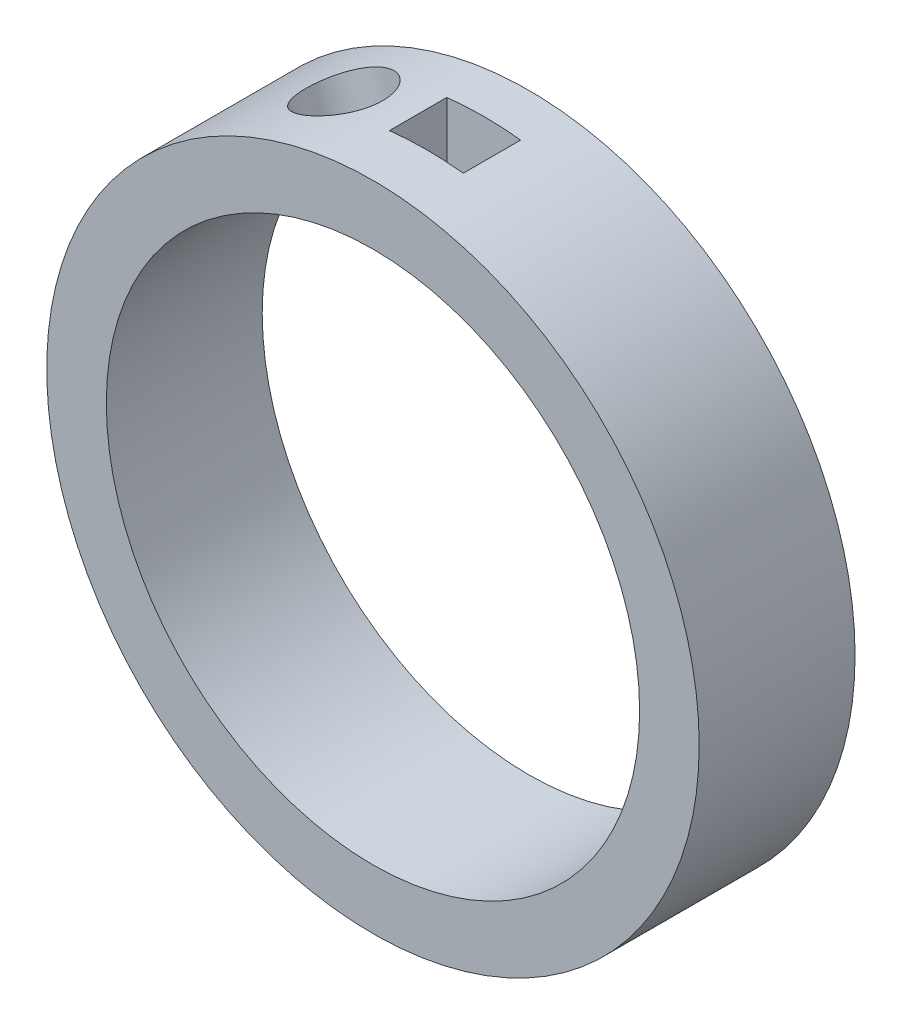
ISO-10303-21;
HEADER;
FILE_DESCRIPTION(('STEP AP214'),'2;1');
FILE_NAME('part.step','',(''),(''),'','','');
FILE_SCHEMA(('AUTOMOTIVE_DESIGN { 1 0 10303 214 1 1 1 1 }'));
ENDSEC;
DATA;
#1=APPLICATION_CONTEXT('core data for automotive mechanical design processes');
#2=APPLICATION_PROTOCOL_DEFINITION('international standard','automotive_design',2000,#1);
#3=PRODUCT_CONTEXT('',#1,'mechanical');
#4=PRODUCT('Part','Part','',(#3));
#5=PRODUCT_RELATED_PRODUCT_CATEGORY('part','',(#4));
#6=PRODUCT_DEFINITION_FORMATION('','',#4);
#7=PRODUCT_DEFINITION_CONTEXT('part definition',#1,'design');
#8=PRODUCT_DEFINITION('design','',#6,#7);
#9=PRODUCT_DEFINITION_SHAPE('','',#8);
#10=(LENGTH_UNIT() NAMED_UNIT(*) SI_UNIT(.MILLI.,.METRE.));
#11=(NAMED_UNIT(*) PLANE_ANGLE_UNIT() SI_UNIT($,.RADIAN.));
#12=(NAMED_UNIT(*) SI_UNIT($,.STERADIAN.) SOLID_ANGLE_UNIT());
#13=UNCERTAINTY_MEASURE_WITH_UNIT(LENGTH_MEASURE(1.E-05),#10,'distance_accuracy_value','');
#14=(GEOMETRIC_REPRESENTATION_CONTEXT(3) GLOBAL_UNCERTAINTY_ASSIGNED_CONTEXT((#13)) GLOBAL_UNIT_ASSIGNED_CONTEXT((#10,
#11,#12)) REPRESENTATION_CONTEXT('',''));
#15=CARTESIAN_POINT('',(0.,0.,0.));
#16=DIRECTION('',(0.,0.,1.));
#17=DIRECTION('',(1.,0.,0.));
#18=AXIS2_PLACEMENT_3D('',#15,#16,#17);
#19=CARTESIAN_POINT('',(0.,0.,-133.006180114648));
#20=DIRECTION('',(0.,0.,1.));
#21=DIRECTION('',(1.,0.,0.));
#22=AXIS2_PLACEMENT_3D('',#19,#20,#21);
#23=CYLINDRICAL_SURFACE('',#22,50.4952);
#24=DIRECTION('',(0.,0.,1.));
#25=VECTOR('',#24,1.);
#26=CARTESIAN_POINT('',(5.715,50.1707484301361,-133.006180114648));
#27=LINE('',#26,#25);
#28=CARTESIAN_POINT('',(5.715,50.1707484301361,-4.445));
#29=VERTEX_POINT('',#28);
#30=CARTESIAN_POINT('',(5.715,50.1707484301361,4.445));
#31=VERTEX_POINT('',#30);
#32=EDGE_CURVE('E11',#29,#31,#27,.T.);
#33=ORIENTED_EDGE('',*,*,#32,.T.);
#34=CARTESIAN_POINT('',(0.,0.,4.445));
#35=DIRECTION('',(0.,0.,-1.));
#36=DIRECTION('',(-1.,0.,0.));
#37=AXIS2_PLACEMENT_3D('',#34,#35,#36);
#38=CIRCLE('',#37,50.4952);
#39=CARTESIAN_POINT('',(-5.715,50.1707484301361,4.445));
#40=VERTEX_POINT('',#39);
#41=EDGE_CURVE('E25',#31,#40,#38,.F.);
#42=ORIENTED_EDGE('',*,*,#41,.T.);
#43=DIRECTION('',(0.,0.,1.));
#44=VECTOR('',#43,1.);
#45=CARTESIAN_POINT('',(-5.715,50.1707484301361,-133.006180114648));
#46=LINE('',#45,#44);
#47=CARTESIAN_POINT('',(-5.715,50.1707484301361,-4.445));
#48=VERTEX_POINT('',#47);
#49=EDGE_CURVE('E77',#48,#40,#46,.T.);
#50=ORIENTED_EDGE('',*,*,#49,.F.);
#51=CARTESIAN_POINT('',(0.,0.,-4.445));
#52=DIRECTION('',(0.,0.,-1.));
#53=DIRECTION('',(-1.,0.,0.));
#54=AXIS2_PLACEMENT_3D('',#51,#52,#53);
#55=CIRCLE('',#54,50.4952);
#56=EDGE_CURVE('E117',#29,#48,#55,.F.);
#57=ORIENTED_EDGE('',*,*,#56,.F.);
#58=EDGE_LOOP('',(#33,#42,#50,#57));
#59=FACE_BOUND('',#58,.T.);
#60=CARTESIAN_POINT('',(0.,0.,12.7));
#61=DIRECTION('',(0.,0.,1.));
#62=DIRECTION('',(1.,0.,0.));
#63=AXIS2_PLACEMENT_3D('',#60,#61,#62);
#64=CIRCLE('',#63,50.4952);
#65=CARTESIAN_POINT('',(50.4952,0.,12.7));
#66=VERTEX_POINT('',#65);
#67=EDGE_CURVE('E114',#66,#66,#64,.T.);
#68=ORIENTED_EDGE('',*,*,#67,.F.);
#69=EDGE_LOOP('',(#68));
#70=FACE_BOUND('',#69,.T.);
#71=CARTESIAN_POINT('',(0.,0.,-11.43));
#72=DIRECTION('',(0.,0.,-1.));
#73=DIRECTION('',(-1.,0.,0.));
#74=AXIS2_PLACEMENT_3D('',#71,#72,#73);
#75=CIRCLE('',#74,50.4952);
#76=CARTESIAN_POINT('',(-50.4952,0.,-11.43));
#77=VERTEX_POINT('',#76);
#78=EDGE_CURVE('E109',#77,#77,#75,.T.);
#79=ORIENTED_EDGE('',*,*,#78,.F.);
#80=EDGE_LOOP('',(#79));
#81=FACE_BOUND('',#80,.T.);
#82=CARTESIAN_POINT('',(-11.1662246003937,49.245107891176,0.));
#83=CARTESIAN_POINT('',(-11.16622243087,49.2451079241868,0.17764524019137));
#84=CARTESIAN_POINT('',(-11.1735559833573,49.2434471139217,0.355260441256935));
#85=CARTESIAN_POINT('',(-11.2028264549851,49.236796595876,0.709276962477321));
#86=CARTESIAN_POINT('',(-11.2247666785135,49.231806134846,0.885677998833001));
#87=CARTESIAN_POINT('',(-11.2830936641882,49.2184712387936,1.23607713344171));
#88=CARTESIAN_POINT('',(-11.3194911672237,49.2101243100603,1.41007334537517));
#89=CARTESIAN_POINT('',(-11.4064439579126,49.190042177864,1.75436028498324));
#90=CARTESIAN_POINT('',(-11.4570044326884,49.1783057329576,1.92464963036286));
#91=CARTESIAN_POINT('',(-11.5717995424469,49.1514205945674,2.26007451008197));
#92=CARTESIAN_POINT('',(-11.6360196826027,49.1362755171397,2.42521529643946));
#93=CARTESIAN_POINT('',(-11.777670262342,49.1025152700211,2.7494351733241));
#94=CARTESIAN_POINT('',(-11.855105567596,49.0838988219771,2.90851200468702));
#95=CARTESIAN_POINT('',(-12.022504545878,49.0431648630898,3.21934774415985));
#96=CARTESIAN_POINT('',(-12.1124613503693,49.0210492707624,3.37111060324377));
#97=CARTESIAN_POINT('',(-12.3042631689757,48.9732590124598,3.66641747210631));
#98=CARTESIAN_POINT('',(-12.4061125845377,48.9475830281226,3.80995840947533));
#99=CARTESIAN_POINT('',(-12.6213877039433,48.8925167352067,4.08842355053718));
#100=CARTESIAN_POINT('',(-12.7348654736039,48.8631095668642,4.22330417191771));
#101=CARTESIAN_POINT('',(-12.9721653750475,48.8006475649764,4.48281914233161));
#102=CARTESIAN_POINT('',(-13.0959913171778,48.7675913863619,4.60744968332333));
#103=CARTESIAN_POINT('',(-13.3529656738582,48.6978566777965,4.84550133865111));
#104=CARTESIAN_POINT('',(-13.4861111137727,48.6611793021533,4.95892600210177));
#105=CARTESIAN_POINT('',(-13.7608036765789,48.5842140415354,5.17385424191154));
#106=CARTESIAN_POINT('',(-13.9023538804553,48.5439248297545,5.27535340554613));
#107=CARTESIAN_POINT('',(-14.1931841361496,48.4596917826087,5.46594717896368));
#108=CARTESIAN_POINT('',(-14.3424860219449,48.4157373864542,5.55500381590273));
#109=CARTESIAN_POINT('',(-14.6473590085822,48.3243772365615,5.7197398314255));
#110=CARTESIAN_POINT('',(-14.8029324154714,48.2769702080207,5.7954142332201));
#111=CARTESIAN_POINT('',(-15.1190831282482,48.1788947148525,5.93276510074974));
#112=CARTESIAN_POINT('',(-15.2796584109043,48.128227560313,5.99444714480022));
#113=CARTESIAN_POINT('',(-15.6046727360808,48.0238342056118,6.10341372526418));
#114=CARTESIAN_POINT('',(-15.7691131738262,47.9701068905301,6.15069297390697));
#115=CARTESIAN_POINT('',(-16.2645264283577,47.8053386769818,6.26985904597561));
#116=CARTESIAN_POINT('',(-16.5996359527191,47.6900804664527,6.31995905979723));
#117=CARTESIAN_POINT('',(-17.2703033571211,47.4513306187826,6.36001359524782));
#118=CARTESIAN_POINT('',(-17.6058612187912,47.3278393094315,6.34997050998239));
#119=CARTESIAN_POINT('',(-18.2661723833157,47.0769174667346,6.27035402432538));
#120=CARTESIAN_POINT('',(-18.5909760008592,46.9495131175358,6.2011171273482));
#121=CARTESIAN_POINT('',(-19.2227792246956,46.694391157762,6.00558335199996));
#122=CARTESIAN_POINT('',(-19.5297784889346,46.5666735412177,5.87928537779128));
#123=CARTESIAN_POINT('',(-20.1186597373741,46.3153066255317,5.57286264651147));
#124=CARTESIAN_POINT('',(-20.4004710919111,46.1916693441179,5.3925923369177));
#125=CARTESIAN_POINT('',(-20.9308152662557,45.9537899048367,4.98344653521398));
#126=CARTESIAN_POINT('',(-21.1793465405473,45.8395481833909,4.75456878706603));
#127=CARTESIAN_POINT('',(-21.6385112033995,45.6246084867768,4.25282056879936));
#128=CARTESIAN_POINT('',(-21.8488705474266,45.5240096646722,3.97965673791803));
#129=CARTESIAN_POINT('',(-22.2242945193402,45.3419191165031,3.39809782430482));
#130=CARTESIAN_POINT('',(-22.3893590021298,45.2604274516463,3.08970262871785));
#131=CARTESIAN_POINT('',(-22.6701079495734,45.1204628421622,2.44617431325994));
#132=CARTESIAN_POINT('',(-22.7857710060322,45.0619998779147,2.11102967598714));
#133=CARTESIAN_POINT('',(-22.9646499330511,44.9711044575202,1.42365174392431));
#134=CARTESIAN_POINT('',(-23.027868362885,44.9386707311609,1.07141928390022));
#135=CARTESIAN_POINT('',(-23.0999773358227,44.9016472950138,0.362438729928718));
#136=CARTESIAN_POINT('',(-23.1092357929607,44.8968690242277,0.00573787476633659));
#137=CARTESIAN_POINT('',(-23.0741711970576,44.9148997548105,-0.704310129539777));
#138=CARTESIAN_POINT('',(-23.0298493002611,44.9377081608688,-1.05765735088789));
#139=CARTESIAN_POINT('',(-22.8890098865747,45.0096056608597,-1.74973737224277));
#140=CARTESIAN_POINT('',(-22.792671155945,45.0586047295077,-2.08851596463985));
#141=CARTESIAN_POINT('',(-22.5503410496534,45.1803676518057,-2.74327494298447));
#142=CARTESIAN_POINT('',(-22.4043479095056,45.2531323499717,-3.05925451827768));
#143=CARTESIAN_POINT('',(-22.0654166867085,45.4193603284046,-3.66130147555207));
#144=CARTESIAN_POINT('',(-21.8722319307493,45.5129321301864,-3.94720000576348));
#145=CARTESIAN_POINT('',(-21.4441081693305,45.7162056086007,-4.47924593904025));
#146=CARTESIAN_POINT('',(-21.2091675196768,45.8259079203642,-4.72539177606154));
#147=CARTESIAN_POINT('',(-20.7019199596484,46.0572877110549,-5.17238752981236));
#148=CARTESIAN_POINT('',(-20.4294052219602,46.1790306485556,-5.37296783049312));
#149=CARTESIAN_POINT('',(-19.8550625048109,46.4288661647257,-5.72127108617559));
#150=CARTESIAN_POINT('',(-19.5532351224677,46.5569586140254,-5.8689951176075));
#151=CARTESIAN_POINT('',(-18.9292304329555,46.8141329384565,-6.1069541518739));
#152=CARTESIAN_POINT('',(-18.6071108261159,46.943211165812,-6.19734472961255));
#153=CARTESIAN_POINT('',(-17.9504411481861,47.1982052556889,-6.31855292797034));
#154=CARTESIAN_POINT('',(-17.6158916454779,47.324121262369,-6.34937326914997));
#155=CARTESIAN_POINT('',(-17.1135397844069,47.5070923350989,-6.35029828705626));
#156=CARTESIAN_POINT('',(-16.9464928339249,47.5669316144663,-6.34314252678187));
#157=CARTESIAN_POINT('',(-16.6129492335679,47.6844449653999,-6.31401155546971));
#158=CARTESIAN_POINT('',(-16.4464524018997,47.742119835128,-6.29204186514639));
#159=CARTESIAN_POINT('',(-16.1151475522208,47.8549674668469,-6.23342869799899));
#160=CARTESIAN_POINT('',(-15.9503401694554,47.9101393125978,-6.19677989532447));
#161=CARTESIAN_POINT('',(-15.6237196362072,48.0176441474498,-6.10909876494134));
#162=CARTESIAN_POINT('',(-15.4619054191765,48.0699781611083,-6.0580716700901));
#163=CARTESIAN_POINT('',(-15.1423964052569,48.1715804401475,-5.94200092154198));
#164=CARTESIAN_POINT('',(-14.9847015953778,48.2208487151963,-5.87695731205088));
#165=CARTESIAN_POINT('',(-14.67464183068,48.3161091801984,-5.73334995742399));
#166=CARTESIAN_POINT('',(-14.522274965043,48.3621025509277,-5.65479112050045));
#167=CARTESIAN_POINT('',(-14.223875599998,48.4507050724001,-5.48466601820468));
#168=CARTESIAN_POINT('',(-14.0778454459458,48.4933129748753,-5.39309498944344));
#169=CARTESIAN_POINT('',(-13.793307870899,48.5750119563282,-5.19764836020996));
#170=CARTESIAN_POINT('',(-13.6547977700587,48.6141042914166,-5.09377718555372));
#171=CARTESIAN_POINT('',(-13.3853300453926,48.6889911418229,-4.87365954302255));
#172=CARTESIAN_POINT('',(-13.2544320416336,48.7247606707602,-4.75733157721416));
#173=CARTESIAN_POINT('',(-13.0022855453458,48.792651485829,-4.5137650608015));
#174=CARTESIAN_POINT('',(-12.8810335725943,48.8247740895494,-4.38653047996718));
#175=CARTESIAN_POINT('',(-12.6489826172454,48.8854053470116,-4.12192013351711));
#176=CARTESIAN_POINT('',(-12.5381899993699,48.9139118038373,-3.98453828255911));
#177=CARTESIAN_POINT('',(-12.3280383120587,48.9672997830887,-3.70071008815298));
#178=CARTESIAN_POINT('',(-12.2286750356447,48.9921826402129,-3.5542671106992));
#179=CARTESIAN_POINT('',(-12.0417145777264,49.0384711390245,-3.25264332203579));
#180=CARTESIAN_POINT('',(-11.9541697067521,49.0598614039636,-3.09742771753361));
#181=CARTESIAN_POINT('',(-11.7920862066084,49.0990720777063,-2.77998966179634));
#182=CARTESIAN_POINT('',(-11.7175428055775,49.1168937966119,-2.61776980868126));
#183=CARTESIAN_POINT('',(-11.5820846257929,49.1490120594498,-2.28754371201484));
#184=CARTESIAN_POINT('',(-11.521159221816,49.1633113525938,-2.11954209853444));
#185=CARTESIAN_POINT('',(-11.413382579187,49.1884435099628,-1.77889048243625));
#186=CARTESIAN_POINT('',(-11.3665280232082,49.1992771912756,-1.60624158593174));
#187=CARTESIAN_POINT('',(-11.273623302502,49.2206631897597,-1.19741524862157));
#188=CARTESIAN_POINT('',(-11.233396131225,49.2298363046774,-0.959817415133804));
#189=CARTESIAN_POINT('',(-11.1796983532134,49.2420586093948,-0.481461321584235));
#190=CARTESIAN_POINT('',(-11.1662275400225,49.2451078464475,-0.240703085923028));
#191=CARTESIAN_POINT('',(-11.1662246003937,49.245107891176,0.));
#192=B_SPLINE_CURVE_WITH_KNOTS('',3,(#82,#83,#84,#85,#86,#87,#88,#89,#90,#91,#92,#93,#94,#95,
#96,#97,#98,#99,#100,#101,#102,#103,#104,#105,#106,#107,#108,#109,#110,#111,#112,#113,#114,#115,
#116,#117,#118,#119,#120,#121,#122,#123,#124,#125,#126,#127,#128,#129,#130,#131,#132,#133,#134,
#135,#136,#137,#138,#139,#140,#141,#142,#143,#144,#145,#146,#147,#148,#149,#150,#151,#152,#153,
#154,#155,#156,#157,#158,#159,#160,#161,#162,#163,#164,#165,#166,#167,#168,#169,#170,#171,#172,
#173,#174,#175,#176,#177,#178,#179,#180,#181,#182,#183,#184,#185,#186,#187,#188,#189,#190,#191),
.UNSPECIFIED.,.T.,.F.,(4,2,2,2,2,2,2,2,2,2,2,2,2,2,2,2,2,2,2,2,2,2,2,2,2,2,2,2,2,2,2,2,2,2,2,2,
2,2,2,2,2,2,2,2,2,2,2,2,2,2,2,2,2,2,4),(0.,0.532725040705638,1.06557063787708,1.59881284995072,
2.13225061541487,2.66512512741974,3.19819626259905,3.73097613117087,4.26395380992556,
4.79943182216301,5.33510788133894,5.87061373413399,6.40631711718759,6.94362125761861,
7.48112480057233,8.018413679598,8.55589957912022,9.62401314895373,10.6920842186231,
11.7541236140249,12.8161834063814,13.8811335618231,14.946133156062,16.0184997107916,
17.0908697006823,18.1637039336573,19.236485809732,20.3019445256539,21.3673802497695,
22.4291770780885,23.4910116416513,24.5585199205186,25.626070243265,26.6997817436323,
27.7734713763709,28.844234935045,29.9149495910111,30.4471881967624,30.9792285624405,
31.511462137205,32.0435022597086,32.5755407042704,33.1073863391721,33.6394271714338,
34.1712771441302,34.7068481464128,35.2422250335917,35.7779256359783,36.3134284192811,
36.8512287340623,37.3888312455326,37.9260128256271,38.4630676608161,39.1848970245053,
39.9067208184228),.UNSPECIFIED.);
#193=CARTESIAN_POINT('',(-11.1662246003937,49.245107891176,0.));
#194=VERTEX_POINT('',#193);
#195=EDGE_CURVE('E101',#194,#194,#192,.T.);
#196=ORIENTED_EDGE('',*,*,#195,.T.);
#197=EDGE_LOOP('',(#196));
#198=FACE_BOUND('',#197,.T.);
#199=ADVANCED_FACE('F17',(#59,#70,#81,#198),#23,.T.);
#200=CARTESIAN_POINT('',(0.,0.,-12.7));
#201=DIRECTION('',(0.,0.,1.));
#202=DIRECTION('',(1.,0.,0.));
#203=AXIS2_PLACEMENT_3D('',#200,#201,#202);
#204=CYLINDRICAL_SURFACE('',#203,41.275);
#205=CARTESIAN_POINT('',(0.,0.,12.7));
#206=DIRECTION('',(0.,0.,1.));
#207=DIRECTION('',(1.,0.,0.));
#208=AXIS2_PLACEMENT_3D('',#205,#206,#207);
#209=CIRCLE('',#208,41.275);
#210=CARTESIAN_POINT('',(41.275,0.,12.7));
#211=VERTEX_POINT('',#210);
#212=EDGE_CURVE('E110',#211,#211,#209,.T.);
#213=ORIENTED_EDGE('',*,*,#212,.T.);
#214=EDGE_LOOP('',(#213));
#215=FACE_BOUND('',#214,.T.);
#216=CARTESIAN_POINT('',(0.,0.,-11.43));
#217=DIRECTION('',(0.,0.,-1.));
#218=DIRECTION('',(-1.,0.,0.));
#219=AXIS2_PLACEMENT_3D('',#216,#217,#218);
#220=CIRCLE('',#219,41.275);
#221=CARTESIAN_POINT('',(-41.275,0.,-11.43));
#222=VERTEX_POINT('',#221);
#223=EDGE_CURVE('E73',#222,#222,#220,.T.);
#224=ORIENTED_EDGE('',*,*,#223,.T.);
#225=EDGE_LOOP('',(#224));
#226=FACE_BOUND('',#225,.T.);
#227=CARTESIAN_POINT('',(0.,0.,4.445));
#228=DIRECTION('',(0.,0.,-1.));
#229=DIRECTION('',(-1.,0.,0.));
#230=AXIS2_PLACEMENT_3D('',#227,#228,#229);
#231=CIRCLE('',#230,41.275);
#232=CARTESIAN_POINT('',(5.715,40.8774314261549,4.445));
#233=VERTEX_POINT('',#232);
#234=CARTESIAN_POINT('',(-5.715,40.8774314261549,4.445));
#235=VERTEX_POINT('',#234);
#236=EDGE_CURVE('E56',#233,#235,#231,.F.);
#237=ORIENTED_EDGE('',*,*,#236,.F.);
#238=DIRECTION('',(0.,0.,1.));
#239=VECTOR('',#238,1.);
#240=CARTESIAN_POINT('',(5.715,40.8774314261549,-12.7));
#241=LINE('',#240,#239);
#242=CARTESIAN_POINT('',(5.715,40.8774314261549,-4.445));
#243=VERTEX_POINT('',#242);
#244=EDGE_CURVE('E74',#243,#233,#241,.T.);
#245=ORIENTED_EDGE('',*,*,#244,.F.);
#246=CARTESIAN_POINT('',(0.,0.,-4.445));
#247=DIRECTION('',(0.,0.,-1.));
#248=DIRECTION('',(-1.,0.,0.));
#249=AXIS2_PLACEMENT_3D('',#246,#247,#248);
#250=CIRCLE('',#249,41.275);
#251=CARTESIAN_POINT('',(-5.715,40.8774314261549,-4.445));
#252=VERTEX_POINT('',#251);
#253=EDGE_CURVE('E59',#243,#252,#250,.F.);
#254=ORIENTED_EDGE('',*,*,#253,.T.);
#255=DIRECTION('',(0.,0.,1.));
#256=VECTOR('',#255,1.);
#257=CARTESIAN_POINT('',(-5.715,40.8774314261549,-12.7));
#258=LINE('',#257,#256);
#259=EDGE_CURVE('E52',#252,#235,#258,.T.);
#260=ORIENTED_EDGE('',*,*,#259,.T.);
#261=EDGE_LOOP('',(#237,#245,#254,#260));
#262=FACE_BOUND('',#261,.T.);
#263=CARTESIAN_POINT('',(-7.98176917116044,40.4958885060979,0.));
#264=CARTESIAN_POINT('',(-7.98176647349376,40.4958883692788,0.177266471995184));
#265=CARTESIAN_POINT('',(-7.9891427179908,40.4944370876854,0.354498380720762));
#266=CARTESIAN_POINT('',(-8.01857909013096,40.4886188099682,0.707745520892735));
#267=CARTESIAN_POINT('',(-8.04064226951074,40.4842512078737,0.883760491795156));
#268=CARTESIAN_POINT('',(-8.09928440907279,40.4725599126413,1.23337190903198));
#269=CARTESIAN_POINT('',(-8.13587310576425,40.4652342366387,1.40696665212277));
#270=CARTESIAN_POINT('',(-8.22326284078746,40.4475655609557,1.75045260420129));
#271=CARTESIAN_POINT('',(-8.27406909374273,40.4372214541351,1.92034242963246));
#272=CARTESIAN_POINT('',(-8.38938605212495,40.4134542549434,2.25496018048823));
#273=CARTESIAN_POINT('',(-8.45388077892395,40.4000347510549,2.41969386963091));
#274=CARTESIAN_POINT('',(-8.59609538515987,40.3700142324993,2.743121289299));
#275=CARTESIAN_POINT('',(-8.67382013793503,40.3534120451913,2.90181276769619));
#276=CARTESIAN_POINT('',(-8.84179732298583,40.3169396646292,3.21192024078573));
#277=CARTESIAN_POINT('',(-8.93204331959875,40.2970711492369,3.36333991955522));
#278=CARTESIAN_POINT('',(-9.12440510968884,40.2539510051791,3.6580137256021));
#279=CARTESIAN_POINT('',(-9.22652531019331,40.2306981196172,3.80126479156874));
#280=CARTESIAN_POINT('',(-9.44257822486114,40.1805391159872,4.07956277256603));
#281=CARTESIAN_POINT('',(-9.55659030734667,40.1536080245141,4.21454357628242));
#282=CARTESIAN_POINT('',(-9.7949664373761,40.0961256296012,4.4742942254629));
#283=CARTESIAN_POINT('',(-9.91933430078156,40.0655729899341,4.59906027314557));
#284=CARTESIAN_POINT('',(-10.1773874230512,40.0008012007428,4.83742643660046));
#285=CARTESIAN_POINT('',(-10.3110697716045,39.9665831946826,4.95103001358494));
#286=CARTESIAN_POINT('',(-10.5868192565117,39.8944256530021,5.16636246265708));
#287=CARTESIAN_POINT('',(-10.7288894663808,39.8564847498088,5.268086940785));
#288=CARTESIAN_POINT('',(-11.0209845276464,39.7767085911598,5.45934234565557));
#289=CARTESIAN_POINT('',(-11.1710436732619,39.7348558459178,5.5488136247374));
#290=CARTESIAN_POINT('',(-11.4774124521125,39.6474465592482,5.71437420929789));
#291=CARTESIAN_POINT('',(-11.6337243903277,39.6018886454623,5.79045852306438));
#292=CARTESIAN_POINT('',(-11.9513126876682,39.5072039172143,5.92861274677592));
#293=CARTESIAN_POINT('',(-12.1125869662269,39.4580785870271,5.99068844154939));
#294=CARTESIAN_POINT('',(-12.4389422738465,39.3564182523768,6.10041557556248));
#295=CARTESIAN_POINT('',(-12.6040246723388,39.3038820085983,6.14806173597835));
#296=CARTESIAN_POINT('',(-13.1003787093158,39.1423739526039,6.26805824661181));
#297=CARTESIAN_POINT('',(-13.4356462003972,39.0286470535243,6.31871782584689));
#298=CARTESIAN_POINT('',(-14.1061741632706,38.7913415806924,6.35998645503663));
#299=CARTESIAN_POINT('',(-14.4414346343309,38.6677635820909,6.35059900827029));
#300=CARTESIAN_POINT('',(-15.0997283061502,38.4154525012503,6.27248739023623));
#301=CARTESIAN_POINT('',(-15.4228408480579,38.2867717581688,6.20426491429312));
#302=CARTESIAN_POINT('',(-16.0509434384318,38.0277314683369,6.01118659311526));
#303=CARTESIAN_POINT('',(-16.35593300069,37.8973718766601,5.88632922924025));
#304=CARTESIAN_POINT('',(-16.9410475375902,37.6394641004197,5.58302063667144));
#305=CARTESIAN_POINT('',(-17.2210692709047,37.5119290925476,5.40435914419376));
#306=CARTESIAN_POINT('',(-17.7479379727134,37.2655476799179,4.99866595252203));
#307=CARTESIAN_POINT('',(-17.9947826439721,37.146701877075,4.77163090667278));
#308=CARTESIAN_POINT('',(-18.4517330632696,36.9218744724846,4.27284277101436));
#309=CARTESIAN_POINT('',(-18.6614323883812,36.8160386483079,4.00065142587637));
#310=CARTESIAN_POINT('',(-19.0358620195155,36.6238448920496,3.42076333010042));
#311=CARTESIAN_POINT('',(-19.2005920206289,36.5374870920372,3.11306633874066));
#312=CARTESIAN_POINT('',(-19.4811872494046,36.3886567299109,2.47044008784074));
#313=CARTESIAN_POINT('',(-19.597010861084,36.3262045140155,2.13548792388618));
#314=CARTESIAN_POINT('',(-19.7766714048331,36.228710171763,1.44811112859345));
#315=CARTESIAN_POINT('',(-19.8405122012162,36.1936660079459,1.09568779809853));
#316=CARTESIAN_POINT('',(-19.9141957671267,36.1531770053526,0.387219039083103));
#317=CARTESIAN_POINT('',(-19.9245822245727,36.1474341460947,0.0312471297946743));
#318=CARTESIAN_POINT('',(-19.892559780554,36.1650661761176,-0.67757682701863));
#319=CARTESIAN_POINT('',(-19.8501526055144,36.1884401132387,-1.03042897618399));
#320=CARTESIAN_POINT('',(-19.7139910300944,36.262792032402,-1.72108801750379));
#321=CARTESIAN_POINT('',(-19.6205096687265,36.3136232137132,-2.05896467405177));
#322=CARTESIAN_POINT('',(-19.3846857400325,36.4400518224791,-2.7122849058962));
#323=CARTESIAN_POINT('',(-19.2423406449215,36.5156505311812,-3.02772731962056));
#324=CARTESIAN_POINT('',(-18.9108832039844,36.6884068020903,-3.62996761318946));
#325=CARTESIAN_POINT('',(-18.7214099637312,36.7857301060884,-3.91651927504831));
#326=CARTESIAN_POINT('',(-18.3007877151295,36.9967839407981,-4.45030951856847));
#327=CARTESIAN_POINT('',(-18.0696362236237,37.1105154490169,-4.69754575619525));
#328=CARTESIAN_POINT('',(-17.5689830722628,37.3501541569123,-5.14789651869679));
#329=CARTESIAN_POINT('',(-17.2991623377874,37.4761595449825,-5.35060434255347));
#330=CARTESIAN_POINT('',(-16.7294604897413,37.7339151027124,-5.70330558939557));
#331=CARTESIAN_POINT('',(-16.429580233302,37.8656651085069,-5.85330051491196));
#332=CARTESIAN_POINT('',(-15.8088788306716,38.1289679833984,-6.0956782066186));
#333=CARTESIAN_POINT('',(-15.4881430169877,38.2605196492718,-6.18828119995836));
#334=CARTESIAN_POINT('',(-14.8332649806115,38.5191307608685,-6.31393558126002));
#335=CARTESIAN_POINT('',(-14.4991236930515,38.6461905187768,-6.346991115745));
#336=CARTESIAN_POINT('',(-13.9972555089176,38.8295522006881,-6.35120047282353));
#337=CARTESIAN_POINT('',(-13.8306394298979,38.8892050528992,-6.34517394194824));
#338=CARTESIAN_POINT('',(-13.4977310573482,39.0059980509715,-6.31837981898705));
#339=CARTESIAN_POINT('',(-13.3314386659366,39.0631391293751,-6.29761774767764));
#340=CARTESIAN_POINT('',(-13.0003196502654,39.1745819775834,-6.24149310825449));
#341=CARTESIAN_POINT('',(-12.8354935724005,39.2288827229791,-6.20612531271931));
#342=CARTESIAN_POINT('',(-12.5086158710711,39.3343314203246,-6.12107435952165));
#343=CARTESIAN_POINT('',(-12.3465632671395,39.3854805037896,-6.07139637630978));
#344=CARTESIAN_POINT('',(-12.0264368036184,39.4844083483663,-5.95811410458414));
#345=CARTESIAN_POINT('',(-11.8683611475986,39.5321886494355,-5.89451623450076));
#346=CARTESIAN_POINT('',(-11.5573257472285,39.624236822585,-5.75387050470069));
#347=CARTESIAN_POINT('',(-11.4043641846744,39.6685059508351,-5.67682748702685));
#348=CARTESIAN_POINT('',(-11.1045631547573,39.7534726827994,-5.50979497232653));
#349=CARTESIAN_POINT('',(-10.9577260562932,39.7941689111442,-5.41980052459117));
#350=CARTESIAN_POINT('',(-10.6713692755021,39.8719138037026,-5.22755467670948));
#351=CARTESIAN_POINT('',(-10.5318470241739,39.9089637525675,-5.12530762174123));
#352=CARTESIAN_POINT('',(-10.2597146120806,39.9797930711205,-4.90813478922289));
#353=CARTESIAN_POINT('',(-10.1271894444467,40.0135352369884,-4.79309035480653));
#354=CARTESIAN_POINT('',(-9.87165895841736,40.0773416626913,-4.55203273895669));
#355=CARTESIAN_POINT('',(-9.74865023975448,40.1074072384378,-4.42602350980389));
#356=CARTESIAN_POINT('',(-9.51297630175193,40.1639590324279,-4.16379044124445));
#357=CARTESIAN_POINT('',(-9.40031734097549,40.1904430894142,-4.02756051058813));
#358=CARTESIAN_POINT('',(-9.18634938645072,40.2398889996938,-3.74594222298432));
#359=CARTESIAN_POINT('',(-9.08503621964856,40.2628521491537,-3.60055726425552));
#360=CARTESIAN_POINT('',(-8.8939180099221,40.3055020927628,-3.3006369904334));
#361=CARTESIAN_POINT('',(-8.80418978513404,40.3251672519592,-3.14604962918323));
#362=CARTESIAN_POINT('',(-8.63777082898884,40.3611420572239,-2.82971020451539));
#363=CARTESIAN_POINT('',(-8.5610753047813,40.3774529373135,-2.6679608026854));
#364=CARTESIAN_POINT('',(-8.42137935984445,40.4068198734042,-2.33850086062174));
#365=CARTESIAN_POINT('',(-8.35836900549636,40.4198782912791,-2.17079474775152));
#366=CARTESIAN_POINT('',(-8.24653079492157,40.4428436677607,-1.83056770458829));
#367=CARTESIAN_POINT('',(-8.19769978823779,40.4527513264698,-1.65804785319365));
#368=CARTESIAN_POINT('',(-8.09838083988354,40.4727735028303,-1.24114255115507));
#369=CARTESIAN_POINT('',(-8.05470931721899,40.4814544268424,-0.995030842097233));
#370=CARTESIAN_POINT('',(-7.99640558569318,40.4930119840916,-0.499256548127418));
#371=CARTESIAN_POINT('',(-7.98177296951805,40.4958886987414,-0.249594013070533));
#372=CARTESIAN_POINT('',(-7.98176917116044,40.4958885060979,0.));
#373=B_SPLINE_CURVE_WITH_KNOTS('',3,(#263,#264,#265,#266,#267,#268,#269,#270,#271,#272,#273,
#274,#275,#276,#277,#278,#279,#280,#281,#282,#283,#284,#285,#286,#287,#288,#289,#290,#291,#292,
#293,#294,#295,#296,#297,#298,#299,#300,#301,#302,#303,#304,#305,#306,#307,#308,#309,#310,#311,
#312,#313,#314,#315,#316,#317,#318,#319,#320,#321,#322,#323,#324,#325,#326,#327,#328,#329,#330,
#331,#332,#333,#334,#335,#336,#337,#338,#339,#340,#341,#342,#343,#344,#345,#346,#347,#348,#349,
#350,#351,#352,#353,#354,#355,#356,#357,#358,#359,#360,#361,#362,#363,#364,#365,#366,#367,#368,
#369,#370,#371,#372),.UNSPECIFIED.,.T.,.F.,(4,2,2,2,2,2,2,2,2,2,2,2,2,2,2,2,2,2,2,2,2,2,2,2,2,2,
2,2,2,2,2,2,2,2,2,2,2,2,2,2,2,2,2,2,2,2,2,2,2,2,2,2,2,2,4),(0.,0.531580680339545,
1.06327185009272,1.595320017834,2.1275635831098,2.65918924149155,3.19101115198448,
3.7225607225935,4.25430820760382,4.78986433926683,5.32561869152096,5.86120639156109,
6.39699157679644,6.93529865491768,7.47380603276974,8.01209062659868,8.55057190636659,
9.61787267972663,10.6851111849188,11.743338166979,12.80159352662,13.8640393771688,
14.9265587553974,16.0000684160417,17.0735853553132,18.1480139519003,19.2223626700126,
20.285762204775,21.3491269658084,22.4068618985244,23.4646515575019,24.5308052848609,
25.5970225538189,26.6726067837433,27.7481603526764,28.8195607782331,29.8908865950921,
30.4215958335144,30.9521063427831,31.4828068877324,32.0133157759308,32.5435805610083,
33.0736547727825,33.6039321472947,34.1340220214325,34.6695173951071,35.2048205417642,
35.7404452877117,36.2758723759697,36.8146850423522,37.353299126423,37.8915209316778,
38.4296230597459,39.1781076143715,39.9265816703132),.UNSPECIFIED.);
#374=CARTESIAN_POINT('',(-7.98176917116044,40.4958885060979,0.));
#375=VERTEX_POINT('',#374);
#376=EDGE_CURVE('E64',#375,#375,#373,.T.);
#377=ORIENTED_EDGE('',*,*,#376,.F.);
#378=EDGE_LOOP('',(#377));
#379=FACE_BOUND('',#378,.T.);
#380=ADVANCED_FACE('F54',(#215,#226,#262,#379),#204,.F.);
#381=CARTESIAN_POINT('',(0.,0.,12.7));
#382=DIRECTION('',(0.,0.,-1.));
#383=DIRECTION('',(1.,0.,0.));
#384=AXIS2_PLACEMENT_3D('',#381,#382,#383);
#385=PLANE('',#384);
#386=ORIENTED_EDGE('',*,*,#212,.F.);
#387=EDGE_LOOP('',(#386));
#388=FACE_BOUND('',#387,.T.);
#389=ORIENTED_EDGE('',*,*,#67,.T.);
#390=EDGE_LOOP('',(#389));
#391=FACE_BOUND('',#390,.T.);
#392=ADVANCED_FACE('F134',(#388,#391),#385,.F.);
#393=CARTESIAN_POINT('',(0.,0.,-11.43));
#394=DIRECTION('',(0.,0.,-1.));
#395=DIRECTION('',(1.,0.,0.));
#396=AXIS2_PLACEMENT_3D('',#393,#394,#395);
#397=PLANE('',#396);
#398=ORIENTED_EDGE('',*,*,#223,.F.);
#399=EDGE_LOOP('',(#398));
#400=FACE_BOUND('',#399,.T.);
#401=ORIENTED_EDGE('',*,*,#78,.T.);
#402=EDGE_LOOP('',(#401));
#403=FACE_BOUND('',#402,.T.);
#404=ADVANCED_FACE('F141',(#400,#403),#397,.T.);
#405=CARTESIAN_POINT('',(0.,144.856051669764,4.445));
#406=DIRECTION('',(0.,0.,-1.));
#407=DIRECTION('',(-1.,0.,0.));
#408=AXIS2_PLACEMENT_3D('',#405,#406,#407);
#409=PLANE('',#408);
#410=DIRECTION('',(0.,-1.,0.));
#411=VECTOR('',#410,1.);
#412=CARTESIAN_POINT('',(5.715,144.856051669764,4.445));
#413=LINE('',#412,#411);
#414=EDGE_CURVE('E71',#31,#233,#413,.T.);
#415=ORIENTED_EDGE('',*,*,#414,.T.);
#416=ORIENTED_EDGE('',*,*,#236,.T.);
#417=DIRECTION('',(0.,-1.,0.));
#418=VECTOR('',#417,1.);
#419=CARTESIAN_POINT('',(-5.715,144.856051669764,4.445));
#420=LINE('',#419,#418);
#421=EDGE_CURVE('E68',#40,#235,#420,.T.);
#422=ORIENTED_EDGE('',*,*,#421,.F.);
#423=ORIENTED_EDGE('',*,*,#41,.F.);
#424=EDGE_LOOP('',(#415,#416,#422,#423));
#425=FACE_BOUND('',#424,.T.);
#426=ADVANCED_FACE('F67',(#425),#409,.T.);
#427=CARTESIAN_POINT('',(-5.715,144.856051669764,0.));
#428=DIRECTION('',(-1.,0.,0.));
#429=DIRECTION('',(0.,0.,1.));
#430=AXIS2_PLACEMENT_3D('',#427,#428,#429);
#431=PLANE('',#430);
#432=ORIENTED_EDGE('',*,*,#49,.T.);
#433=ORIENTED_EDGE('',*,*,#421,.T.);
#434=ORIENTED_EDGE('',*,*,#259,.F.);
#435=DIRECTION('',(0.,-1.,0.));
#436=VECTOR('',#435,1.);
#437=CARTESIAN_POINT('',(-5.715,144.856051669764,-4.445));
#438=LINE('',#437,#436);
#439=EDGE_CURVE('E78',#48,#252,#438,.T.);
#440=ORIENTED_EDGE('',*,*,#439,.F.);
#441=EDGE_LOOP('',(#432,#433,#434,#440));
#442=FACE_BOUND('',#441,.T.);
#443=ADVANCED_FACE('F76',(#442),#431,.F.);
#444=CARTESIAN_POINT('',(0.,144.856051669764,-4.445));
#445=DIRECTION('',(0.,0.,-1.));
#446=DIRECTION('',(-1.,0.,0.));
#447=AXIS2_PLACEMENT_3D('',#444,#445,#446);
#448=PLANE('',#447);
#449=ORIENTED_EDGE('',*,*,#56,.T.);
#450=ORIENTED_EDGE('',*,*,#439,.T.);
#451=ORIENTED_EDGE('',*,*,#253,.F.);
#452=DIRECTION('',(0.,-1.,0.));
#453=VECTOR('',#452,1.);
#454=CARTESIAN_POINT('',(5.715,144.856051669764,-4.445));
#455=LINE('',#454,#453);
#456=EDGE_CURVE('E81',#29,#243,#455,.T.);
#457=ORIENTED_EDGE('',*,*,#456,.F.);
#458=EDGE_LOOP('',(#449,#450,#451,#457));
#459=FACE_BOUND('',#458,.T.);
#460=ADVANCED_FACE('F122',(#459),#448,.F.);
#461=CARTESIAN_POINT('',(5.715,144.856051669764,0.));
#462=DIRECTION('',(-1.,0.,0.));
#463=DIRECTION('',(0.,0.,1.));
#464=AXIS2_PLACEMENT_3D('',#461,#462,#463);
#465=PLANE('',#464);
#466=ORIENTED_EDGE('',*,*,#456,.T.);
#467=ORIENTED_EDGE('',*,*,#244,.T.);
#468=ORIENTED_EDGE('',*,*,#414,.F.);
#469=ORIENTED_EDGE('',*,*,#32,.F.);
#470=EDGE_LOOP('',(#466,#467,#468,#469));
#471=FACE_BOUND('',#470,.T.);
#472=ADVANCED_FACE('F97',(#471),#465,.T.);
#473=CARTESIAN_POINT('',(-20.4965031555632,56.3136795976903,0.));
#474=DIRECTION('',(0.342020143325669,-0.939692620785908,0.));
#475=DIRECTION('',(0.939692620785908,0.342020143325669,0.));
#476=AXIS2_PLACEMENT_3D('',#473,#474,#475);
#477=CYLINDRICAL_SURFACE('',#476,6.35);
#478=ORIENTED_EDGE('',*,*,#195,.F.);
#479=EDGE_LOOP('',(#478));
#480=FACE_BOUND('',#479,.T.);
#481=ORIENTED_EDGE('',*,*,#376,.T.);
#482=EDGE_LOOP('',(#481));
#483=FACE_BOUND('',#482,.T.);
#484=ADVANCED_FACE('F94',(#480,#483),#477,.F.);
#485=CLOSED_SHELL('',(#199,#380,#392,#404,#426,#443,#460,#472,#484));
#486=MANIFOLD_SOLID_BREP('B1',#485);
#487=ADVANCED_BREP_SHAPE_REPRESENTATION('',(#18,#486),#14);
#488=SHAPE_DEFINITION_REPRESENTATION(#9,#487);
ENDSEC;
END-ISO-10303-21;
